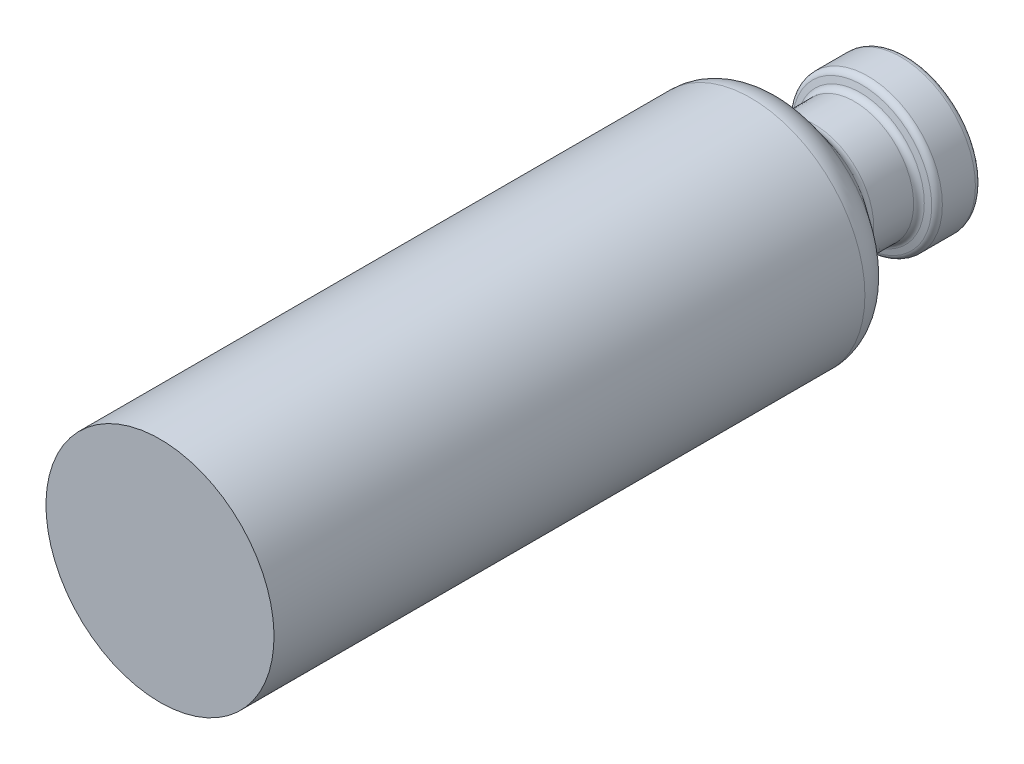
ISO-10303-21;
HEADER;
FILE_DESCRIPTION(('STEP AP214'),'2;1');
FILE_NAME('part.step','',(''),(''),'','','');
FILE_SCHEMA(('AUTOMOTIVE_DESIGN { 1 0 10303 214 1 1 1 1 }'));
ENDSEC;
DATA;
#1=APPLICATION_CONTEXT('core data for automotive mechanical design processes');
#2=APPLICATION_PROTOCOL_DEFINITION('international standard','automotive_design',2000,#1);
#3=PRODUCT_CONTEXT('',#1,'mechanical');
#4=PRODUCT('Part','Part','',(#3));
#5=PRODUCT_RELATED_PRODUCT_CATEGORY('part','',(#4));
#6=PRODUCT_DEFINITION_FORMATION('','',#4);
#7=PRODUCT_DEFINITION_CONTEXT('part definition',#1,'design');
#8=PRODUCT_DEFINITION('design','',#6,#7);
#9=PRODUCT_DEFINITION_SHAPE('','',#8);
#10=(LENGTH_UNIT() NAMED_UNIT(*) SI_UNIT(.MILLI.,.METRE.));
#11=(NAMED_UNIT(*) PLANE_ANGLE_UNIT() SI_UNIT($,.RADIAN.));
#12=(NAMED_UNIT(*) SI_UNIT($,.STERADIAN.) SOLID_ANGLE_UNIT());
#13=UNCERTAINTY_MEASURE_WITH_UNIT(LENGTH_MEASURE(1.E-05),#10,'distance_accuracy_value','');
#14=(GEOMETRIC_REPRESENTATION_CONTEXT(3) GLOBAL_UNCERTAINTY_ASSIGNED_CONTEXT((#13)) GLOBAL_UNIT_ASSIGNED_CONTEXT((#10,
#11,#12)) REPRESENTATION_CONTEXT('',''));
#15=CARTESIAN_POINT('',(0.,0.,0.));
#16=DIRECTION('',(0.,0.,1.));
#17=DIRECTION('',(1.,0.,0.));
#18=AXIS2_PLACEMENT_3D('',#15,#16,#17);
#19=CARTESIAN_POINT('',(0.,0.,36.1766330125474));
#20=DIRECTION('',(0.,0.,-1.));
#21=DIRECTION('',(0.,1.,0.));
#22=AXIS2_PLACEMENT_3D('',#19,#20,#21);
#23=CYLINDRICAL_SURFACE('',#22,5.475);
#24=DIRECTION('',(0.,0.,1.));
#25=VECTOR('',#24,1.);
#26=CARTESIAN_POINT('',(0.,-5.475,36.1766330125474));
#27=LINE('',#26,#25);
#28=CARTESIAN_POINT('',(0.,-5.475,7.80326602509486));
#29=VERTEX_POINT('',#28);
#30=CARTESIAN_POINT('',(0.,-5.475,36.175));
#31=VERTEX_POINT('',#30);
#32=EDGE_CURVE('E168',#29,#31,#27,.T.);
#33=ORIENTED_EDGE('',*,*,#32,.T.);
#34=CARTESIAN_POINT('',(0.,0.,36.175));
#35=DIRECTION('',(0.,0.,1.));
#36=DIRECTION('',(1.,0.,0.));
#37=AXIS2_PLACEMENT_3D('',#34,#35,#36);
#38=CIRCLE('',#37,5.475);
#39=EDGE_CURVE('E58',#31,#31,#38,.T.);
#40=ORIENTED_EDGE('',*,*,#39,.F.);
#41=ORIENTED_EDGE('',*,*,#32,.F.);
#42=CARTESIAN_POINT('',(0.,0.,7.80326602509486));
#43=DIRECTION('',(0.,0.,-1.));
#44=DIRECTION('',(1.,0.,0.));
#45=AXIS2_PLACEMENT_3D('',#42,#43,#44);
#46=CIRCLE('',#45,5.475);
#47=CARTESIAN_POINT('',(5.475,0.,7.80326602509486));
#48=VERTEX_POINT('',#47);
#49=EDGE_CURVE('E157',#48,#29,#46,.T.);
#50=ORIENTED_EDGE('',*,*,#49,.F.);
#51=CARTESIAN_POINT('',(0.,0.,7.80326602509486));
#52=DIRECTION('',(0.,0.,-1.));
#53=DIRECTION('',(1.,0.,0.));
#54=AXIS2_PLACEMENT_3D('',#51,#52,#53);
#55=CIRCLE('',#54,5.475);
#56=EDGE_CURVE('E167',#29,#48,#55,.T.);
#57=ORIENTED_EDGE('',*,*,#56,.F.);
#58=EDGE_LOOP('',(#33,#40,#41,#50,#57));
#59=FACE_BOUND('',#58,.T.);
#60=ADVANCED_FACE('F43',(#59),#23,.T.);
#61=CARTESIAN_POINT('',(0.,0.,0.492619400818587));
#62=DIRECTION('',(0.,0.,-1.));
#63=DIRECTION('',(0.,1.,0.));
#64=AXIS2_PLACEMENT_3D('',#61,#62,#63);
#65=CYLINDRICAL_SURFACE('',#64,1.775);
#66=CARTESIAN_POINT('',(0.,0.,0.485238801637173));
#67=DIRECTION('',(0.,0.,-1.));
#68=DIRECTION('',(1.,0.,0.));
#69=AXIS2_PLACEMENT_3D('',#66,#67,#68);
#70=CIRCLE('',#69,1.775);
#71=CARTESIAN_POINT('',(0.,-1.775,0.485238801637173));
#72=VERTEX_POINT('',#71);
#73=CARTESIAN_POINT('',(1.775,0.,0.485238801637173));
#74=VERTEX_POINT('',#73);
#75=EDGE_CURVE('E47',#72,#74,#70,.T.);
#76=ORIENTED_EDGE('',*,*,#75,.T.);
#77=CARTESIAN_POINT('',(0.,0.,0.485238801637173));
#78=DIRECTION('',(0.,0.,-1.));
#79=DIRECTION('',(1.,0.,0.));
#80=AXIS2_PLACEMENT_3D('',#77,#78,#79);
#81=CIRCLE('',#80,1.775);
#82=EDGE_CURVE('E223',#74,#72,#81,.T.);
#83=ORIENTED_EDGE('',*,*,#82,.T.);
#84=DIRECTION('',(0.,0.,1.));
#85=VECTOR('',#84,1.);
#86=CARTESIAN_POINT('',(0.,-1.775,0.492619400818587));
#87=LINE('',#86,#85);
#88=CARTESIAN_POINT('',(0.,-1.775,0.5));
#89=VERTEX_POINT('',#88);
#90=EDGE_CURVE('E11',#72,#89,#87,.T.);
#91=ORIENTED_EDGE('',*,*,#90,.T.);
#92=CARTESIAN_POINT('',(0.,0.,0.5));
#93=DIRECTION('',(0.,0.,-1.));
#94=DIRECTION('',(1.,0.,0.));
#95=AXIS2_PLACEMENT_3D('',#92,#93,#94);
#96=CIRCLE('',#95,1.775);
#97=EDGE_CURVE('E253',#89,#89,#96,.T.);
#98=ORIENTED_EDGE('',*,*,#97,.F.);
#99=ORIENTED_EDGE('',*,*,#90,.F.);
#100=EDGE_LOOP('',(#76,#83,#91,#98,#99));
#101=FACE_BOUND('',#100,.T.);
#102=ADVANCED_FACE('F277',(#101),#65,.F.);
#103=CARTESIAN_POINT('',(0.,0.,0.485238801637173));
#104=DIRECTION('',(0.,0.,-1.));
#105=DIRECTION('',(-1.,0.,0.));
#106=AXIS2_PLACEMENT_3D('',#103,#104,#105);
#107=TOROIDAL_SURFACE('',#106,2.175,0.4);
#108=ORIENTED_EDGE('',*,*,#75,.F.);
#109=ORIENTED_EDGE('',*,*,#82,.F.);
#110=CARTESIAN_POINT('',(2.175,0.,0.485238801637173));
#111=DIRECTION('',(0.,-1.,0.));
#112=DIRECTION('',(1.,0.,0.));
#113=AXIS2_PLACEMENT_3D('',#110,#111,#112);
#114=CIRCLE('',#113,0.4);
#115=CARTESIAN_POINT('',(2.25132359815062,0.,0.0925879282581075));
#116=VERTEX_POINT('',#115);
#117=EDGE_CURVE('E52',#74,#116,#114,.T.);
#118=ORIENTED_EDGE('',*,*,#117,.T.);
#119=CARTESIAN_POINT('',(0.,0.,0.0925879282581075));
#120=DIRECTION('',(0.,0.,-1.));
#121=DIRECTION('',(1.,0.,0.));
#122=AXIS2_PLACEMENT_3D('',#119,#120,#121);
#123=CIRCLE('',#122,2.25132359815062);
#124=CARTESIAN_POINT('',(0.,-2.25132359815062,0.0925879282581076));
#125=VERTEX_POINT('',#124);
#126=EDGE_CURVE('E190',#116,#125,#123,.T.);
#127=ORIENTED_EDGE('',*,*,#126,.T.);
#128=CARTESIAN_POINT('',(0.,0.,0.0925879282581075));
#129=DIRECTION('',(0.,0.,-1.));
#130=DIRECTION('',(1.,0.,0.));
#131=AXIS2_PLACEMENT_3D('',#128,#129,#130);
#132=CIRCLE('',#131,2.25132359815062);
#133=EDGE_CURVE('E191',#125,#116,#132,.T.);
#134=ORIENTED_EDGE('',*,*,#133,.T.);
#135=ORIENTED_EDGE('',*,*,#117,.F.);
#136=EDGE_LOOP('',(#108,#109,#118,#127,#134,#135));
#137=FACE_BOUND('',#136,.T.);
#138=ADVANCED_FACE('F257',(#137),#107,.T.);
#139=CARTESIAN_POINT('',(0.,0.,0.197642622708475));
#140=DIRECTION('',(0.,0.,1.));
#141=DIRECTION('',(0.,1.,0.));
#142=AXIS2_PLACEMENT_3D('',#139,#140,#141);
#143=CONICAL_SURFACE('',#142,2.79178314838179,1.37881010907552);
#144=ORIENTED_EDGE('',*,*,#133,.F.);
#145=DIRECTION('',(0.,-0.981627183447664,0.190808995376545));
#146=VECTOR('',#145,1.);
#147=CARTESIAN_POINT('',(0.,-2.79178314838179,0.197642622708475));
#148=LINE('',#147,#146);
#149=CARTESIAN_POINT('',(0.,-3.33224269861296,0.302697317158843));
#150=VERTEX_POINT('',#149);
#151=EDGE_CURVE('E188',#125,#150,#148,.T.);
#152=ORIENTED_EDGE('',*,*,#151,.T.);
#153=CARTESIAN_POINT('',(0.,0.,0.302697317158843));
#154=DIRECTION('',(0.,0.,-1.));
#155=DIRECTION('',(1.,0.,0.));
#156=AXIS2_PLACEMENT_3D('',#153,#154,#155);
#157=CIRCLE('',#156,3.33224269861296);
#158=CARTESIAN_POINT('',(3.33224269861296,0.,0.302697317158843));
#159=VERTEX_POINT('',#158);
#160=EDGE_CURVE('E186',#150,#159,#157,.T.);
#161=ORIENTED_EDGE('',*,*,#160,.T.);
#162=CARTESIAN_POINT('',(0.,0.,0.302697317158843));
#163=DIRECTION('',(0.,0.,-1.));
#164=DIRECTION('',(1.,0.,0.));
#165=AXIS2_PLACEMENT_3D('',#162,#163,#164);
#166=CIRCLE('',#165,3.33224269861296);
#167=EDGE_CURVE('E215',#159,#150,#166,.T.);
#168=ORIENTED_EDGE('',*,*,#167,.T.);
#169=ORIENTED_EDGE('',*,*,#151,.F.);
#170=ORIENTED_EDGE('',*,*,#126,.F.);
#171=EDGE_LOOP('',(#144,#152,#161,#168,#169,#170));
#172=FACE_BOUND('',#171,.T.);
#173=ADVANCED_FACE('F261',(#172),#143,.T.);
#174=CARTESIAN_POINT('',(0.,0.,0.597185472193142));
#175=DIRECTION('',(0.,0.,-1.));
#176=DIRECTION('',(-1.,0.,0.));
#177=AXIS2_PLACEMENT_3D('',#174,#175,#176);
#178=TOROIDAL_SURFACE('',#177,3.275,0.3);
#179=ORIENTED_EDGE('',*,*,#160,.F.);
#180=ORIENTED_EDGE('',*,*,#167,.F.);
#181=CARTESIAN_POINT('',(3.275,0.,0.597185472193142));
#182=DIRECTION('',(0.,-1.,0.));
#183=DIRECTION('',(1.,0.,0.));
#184=AXIS2_PLACEMENT_3D('',#181,#182,#183);
#185=CIRCLE('',#184,0.3);
#186=CARTESIAN_POINT('',(3.575,0.,0.597185472193142));
#187=VERTEX_POINT('',#186);
#188=EDGE_CURVE('E152',#159,#187,#185,.T.);
#189=ORIENTED_EDGE('',*,*,#188,.T.);
#190=CARTESIAN_POINT('',(0.,0.,0.597185472193142));
#191=DIRECTION('',(0.,0.,-1.));
#192=DIRECTION('',(1.,0.,0.));
#193=AXIS2_PLACEMENT_3D('',#190,#191,#192);
#194=CIRCLE('',#193,3.575);
#195=CARTESIAN_POINT('',(0.,-3.575,0.597185472193142));
#196=VERTEX_POINT('',#195);
#197=EDGE_CURVE('E148',#187,#196,#194,.T.);
#198=ORIENTED_EDGE('',*,*,#197,.T.);
#199=CARTESIAN_POINT('',(0.,0.,0.597185472193142));
#200=DIRECTION('',(0.,0.,-1.));
#201=DIRECTION('',(1.,0.,0.));
#202=AXIS2_PLACEMENT_3D('',#199,#200,#201);
#203=CIRCLE('',#202,3.575);
#204=EDGE_CURVE('E202',#196,#187,#203,.T.);
#205=ORIENTED_EDGE('',*,*,#204,.T.);
#206=ORIENTED_EDGE('',*,*,#188,.F.);
#207=EDGE_LOOP('',(#179,#180,#189,#198,#205,#206));
#208=FACE_BOUND('',#207,.T.);
#209=ADVANCED_FACE('F263',(#208),#178,.T.);
#210=CARTESIAN_POINT('',(0.,0.,1.39043596612367));
#211=DIRECTION('',(0.,0.,-1.));
#212=DIRECTION('',(0.,1.,0.));
#213=AXIS2_PLACEMENT_3D('',#210,#211,#212);
#214=CYLINDRICAL_SURFACE('',#213,3.575);
#215=ORIENTED_EDGE('',*,*,#204,.F.);
#216=DIRECTION('',(0.,0.,1.));
#217=VECTOR('',#216,1.);
#218=CARTESIAN_POINT('',(0.,-3.575,1.39043596612367));
#219=LINE('',#218,#217);
#220=CARTESIAN_POINT('',(0.,-3.575,2.18368646005421));
#221=VERTEX_POINT('',#220);
#222=EDGE_CURVE('E187',#196,#221,#219,.T.);
#223=ORIENTED_EDGE('',*,*,#222,.T.);
#224=CARTESIAN_POINT('',(0.,0.,2.18368646005421));
#225=DIRECTION('',(0.,0.,-1.));
#226=DIRECTION('',(1.,0.,0.));
#227=AXIS2_PLACEMENT_3D('',#224,#225,#226);
#228=CIRCLE('',#227,3.575);
#229=CARTESIAN_POINT('',(3.575,0.,2.18368646005421));
#230=VERTEX_POINT('',#229);
#231=EDGE_CURVE('E199',#221,#230,#228,.T.);
#232=ORIENTED_EDGE('',*,*,#231,.T.);
#233=CARTESIAN_POINT('',(0.,0.,2.18368646005421));
#234=DIRECTION('',(0.,0.,-1.));
#235=DIRECTION('',(1.,0.,0.));
#236=AXIS2_PLACEMENT_3D('',#233,#234,#235);
#237=CIRCLE('',#236,3.575);
#238=EDGE_CURVE('E196',#230,#221,#237,.T.);
#239=ORIENTED_EDGE('',*,*,#238,.T.);
#240=ORIENTED_EDGE('',*,*,#222,.F.);
#241=ORIENTED_EDGE('',*,*,#197,.F.);
#242=EDGE_LOOP('',(#215,#223,#232,#239,#240,#241));
#243=FACE_BOUND('',#242,.T.);
#244=ADVANCED_FACE('F265',(#243),#214,.T.);
#245=CARTESIAN_POINT('',(0.,0.,2.18368646005421));
#246=DIRECTION('',(0.,0.,-1.));
#247=DIRECTION('',(-1.,0.,0.));
#248=AXIS2_PLACEMENT_3D('',#245,#246,#247);
#249=TOROIDAL_SURFACE('',#248,3.275,0.3);
#250=ORIENTED_EDGE('',*,*,#231,.F.);
#251=ORIENTED_EDGE('',*,*,#238,.F.);
#252=CARTESIAN_POINT('',(3.275,0.,2.18368646005421));
#253=DIRECTION('',(0.,-1.,0.));
#254=DIRECTION('',(1.,0.,0.));
#255=AXIS2_PLACEMENT_3D('',#252,#253,#254);
#256=CIRCLE('',#255,0.3);
#257=CARTESIAN_POINT('',(3.35264571353076,0.,2.47346420794093));
#258=VERTEX_POINT('',#257);
#259=EDGE_CURVE('E198',#230,#258,#256,.T.);
#260=ORIENTED_EDGE('',*,*,#259,.T.);
#261=CARTESIAN_POINT('',(0.,0.,2.47346420794093));
#262=DIRECTION('',(0.,0.,-1.));
#263=DIRECTION('',(1.,0.,0.));
#264=AXIS2_PLACEMENT_3D('',#261,#262,#263);
#265=CIRCLE('',#264,3.35264571353076);
#266=CARTESIAN_POINT('',(0.,-3.35264571353076,2.47346420794093));
#267=VERTEX_POINT('',#266);
#268=EDGE_CURVE('E194',#258,#267,#265,.T.);
#269=ORIENTED_EDGE('',*,*,#268,.T.);
#270=CARTESIAN_POINT('',(0.,0.,2.47346420794093));
#271=DIRECTION('',(0.,0.,-1.));
#272=DIRECTION('',(1.,0.,0.));
#273=AXIS2_PLACEMENT_3D('',#270,#271,#272);
#274=CIRCLE('',#273,3.35264571353076);
#275=EDGE_CURVE('E195',#267,#258,#274,.T.);
#276=ORIENTED_EDGE('',*,*,#275,.T.);
#277=ORIENTED_EDGE('',*,*,#259,.F.);
#278=EDGE_LOOP('',(#250,#251,#260,#269,#276,#277));
#279=FACE_BOUND('',#278,.T.);
#280=ADVANCED_FACE('F271',(#279),#249,.T.);
#281=CARTESIAN_POINT('',(0.,0.,2.51106581691542));
#282=DIRECTION('',(0.,0.,-1.));
#283=DIRECTION('',(0.,1.,0.));
#284=AXIS2_PLACEMENT_3D('',#281,#282,#283);
#285=CONICAL_SURFACE('',#284,3.21231459839161,1.30899693899575);
#286=ORIENTED_EDGE('',*,*,#275,.F.);
#287=DIRECTION('',(0.,0.965925826289069,0.258819045102519));
#288=VECTOR('',#287,1.);
#289=CARTESIAN_POINT('',(0.,-3.21231459839161,2.51106581691542));
#290=LINE('',#289,#288);
#291=CARTESIAN_POINT('',(0.,-3.07198348325247,2.54866742588991));
#292=VERTEX_POINT('',#291);
#293=EDGE_CURVE('E192',#267,#292,#290,.T.);
#294=ORIENTED_EDGE('',*,*,#293,.T.);
#295=CARTESIAN_POINT('',(0.,0.,2.54866742588991));
#296=DIRECTION('',(0.,0.,-1.));
#297=DIRECTION('',(1.,0.,0.));
#298=AXIS2_PLACEMENT_3D('',#295,#296,#297);
#299=CIRCLE('',#298,3.07198348325247);
#300=CARTESIAN_POINT('',(3.07198348325247,0.,2.54866742588991));
#301=VERTEX_POINT('',#300);
#302=EDGE_CURVE('E231',#292,#301,#299,.T.);
#303=ORIENTED_EDGE('',*,*,#302,.T.);
#304=CARTESIAN_POINT('',(0.,0.,2.54866742588991));
#305=DIRECTION('',(0.,0.,-1.));
#306=DIRECTION('',(1.,0.,0.));
#307=AXIS2_PLACEMENT_3D('',#304,#305,#306);
#308=CIRCLE('',#307,3.07198348325247);
#309=EDGE_CURVE('E233',#301,#292,#308,.T.);
#310=ORIENTED_EDGE('',*,*,#309,.T.);
#311=ORIENTED_EDGE('',*,*,#293,.F.);
#312=ORIENTED_EDGE('',*,*,#268,.F.);
#313=EDGE_LOOP('',(#286,#294,#303,#310,#311,#312));
#314=FACE_BOUND('',#313,.T.);
#315=ADVANCED_FACE('F304',(#314),#285,.T.);
#316=CARTESIAN_POINT('',(0.,0.,2.83844517377663));
#317=DIRECTION('',(0.,0.,-1.));
#318=DIRECTION('',(-1.,0.,0.));
#319=AXIS2_PLACEMENT_3D('',#316,#317,#318);
#320=TOROIDAL_SURFACE('',#319,3.14962919678323,0.3);
#321=CARTESIAN_POINT('',(0.,0.,2.83849663779055));
#322=DIRECTION('',(0.,0.,-1.));
#323=DIRECTION('',(1.,0.,0.));
#324=AXIS2_PLACEMENT_3D('',#321,#322,#323);
#325=CIRCLE('',#324,2.84962920119747);
#326=CARTESIAN_POINT('',(0.,-2.84962920119747,2.83849663779055));
#327=VERTEX_POINT('',#326);
#328=CARTESIAN_POINT('',(2.84962920119747,0.,2.83849663779055));
#329=VERTEX_POINT('',#328);
#330=EDGE_CURVE('E230',#327,#329,#325,.T.);
#331=ORIENTED_EDGE('',*,*,#330,.T.);
#332=CARTESIAN_POINT('',(3.14962919678323,0.,2.83844517377663));
#333=DIRECTION('',(0.,-1.,0.));
#334=DIRECTION('',(1.,0.,0.));
#335=AXIS2_PLACEMENT_3D('',#332,#333,#334);
#336=CIRCLE('',#335,0.3);
#337=EDGE_CURVE('E218',#329,#301,#336,.T.);
#338=ORIENTED_EDGE('',*,*,#337,.T.);
#339=ORIENTED_EDGE('',*,*,#302,.F.);
#340=ORIENTED_EDGE('',*,*,#309,.F.);
#341=ORIENTED_EDGE('',*,*,#337,.F.);
#342=CARTESIAN_POINT('',(0.,0.,2.83849663779055));
#343=DIRECTION('',(0.,0.,-1.));
#344=DIRECTION('',(1.,0.,0.));
#345=AXIS2_PLACEMENT_3D('',#342,#343,#344);
#346=CIRCLE('',#345,2.84962920119747);
#347=EDGE_CURVE('E216',#329,#327,#346,.T.);
#348=ORIENTED_EDGE('',*,*,#347,.T.);
#349=EDGE_LOOP('',(#331,#338,#339,#340,#341,#348));
#350=FACE_BOUND('',#349,.T.);
#351=ADVANCED_FACE('F286',(#350),#320,.F.);
#352=CARTESIAN_POINT('',(0.,0.,3.79598862127023));
#353=DIRECTION('',(0.,0.,1.));
#354=DIRECTION('',(0.,1.,0.));
#355=AXIS2_PLACEMENT_3D('',#352,#353,#354);
#356=CONICAL_SURFACE('',#355,2.84979345580244,0.00017154671375515);
#357=ORIENTED_EDGE('',*,*,#330,.F.);
#358=DIRECTION('',(0.,-0.000171546713069514,0.999999985285863));
#359=VECTOR('',#358,1.);
#360=CARTESIAN_POINT('',(0.,-2.84979345580244,3.79598862127023));
#361=LINE('',#360,#359);
#362=CARTESIAN_POINT('',(0.,-2.84995771040741,4.7534806047499));
#363=VERTEX_POINT('',#362);
#364=EDGE_CURVE('E219',#327,#363,#361,.T.);
#365=ORIENTED_EDGE('',*,*,#364,.T.);
#366=CARTESIAN_POINT('',(0.,0.,4.7534806047499));
#367=DIRECTION('',(0.,0.,-1.));
#368=DIRECTION('',(1.,0.,0.));
#369=AXIS2_PLACEMENT_3D('',#366,#367,#368);
#370=CIRCLE('',#369,2.84995771040741);
#371=CARTESIAN_POINT('',(2.84995771040741,0.,4.7534806047499));
#372=VERTEX_POINT('',#371);
#373=EDGE_CURVE('E180',#363,#372,#370,.T.);
#374=ORIENTED_EDGE('',*,*,#373,.T.);
#375=CARTESIAN_POINT('',(0.,0.,4.7534806047499));
#376=DIRECTION('',(0.,0.,-1.));
#377=DIRECTION('',(1.,0.,0.));
#378=AXIS2_PLACEMENT_3D('',#375,#376,#377);
#379=CIRCLE('',#378,2.84995771040741);
#380=EDGE_CURVE('E183',#372,#363,#379,.T.);
#381=ORIENTED_EDGE('',*,*,#380,.T.);
#382=ORIENTED_EDGE('',*,*,#364,.F.);
#383=ORIENTED_EDGE('',*,*,#347,.F.);
#384=EDGE_LOOP('',(#357,#365,#374,#381,#382,#383));
#385=FACE_BOUND('',#384,.T.);
#386=ADVANCED_FACE('F287',(#385),#356,.T.);
#387=CARTESIAN_POINT('',(0.,0.,4.75339483139337));
#388=DIRECTION('',(0.,0.,-1.));
#389=DIRECTION('',(-1.,0.,0.));
#390=AXIS2_PLACEMENT_3D('',#387,#388,#389);
#391=TOROIDAL_SURFACE('',#390,3.34995770305035,0.5);
#392=CARTESIAN_POINT('',(0.,0.,5.15007150153899));
#393=DIRECTION('',(0.,0.,-1.));
#394=DIRECTION('',(1.,0.,0.));
#395=AXIS2_PLACEMENT_3D('',#392,#393,#394);
#396=CIRCLE('',#395,3.04557698854599);
#397=CARTESIAN_POINT('',(0.,-3.04557698854599,5.15007150153899));
#398=VERTEX_POINT('',#397);
#399=CARTESIAN_POINT('',(3.04557698854599,0.,5.15007150153899));
#400=VERTEX_POINT('',#399);
#401=EDGE_CURVE('E162',#398,#400,#396,.T.);
#402=ORIENTED_EDGE('',*,*,#401,.T.);
#403=CARTESIAN_POINT('',(3.34995770305035,0.,4.75339483139337));
#404=DIRECTION('',(0.,-1.,0.));
#405=DIRECTION('',(1.,0.,0.));
#406=AXIS2_PLACEMENT_3D('',#403,#404,#405);
#407=CIRCLE('',#406,0.5);
#408=EDGE_CURVE('E184',#400,#372,#407,.T.);
#409=ORIENTED_EDGE('',*,*,#408,.T.);
#410=ORIENTED_EDGE('',*,*,#373,.F.);
#411=ORIENTED_EDGE('',*,*,#380,.F.);
#412=ORIENTED_EDGE('',*,*,#408,.F.);
#413=CARTESIAN_POINT('',(0.,0.,5.15007150153899));
#414=DIRECTION('',(0.,0.,-1.));
#415=DIRECTION('',(1.,0.,0.));
#416=AXIS2_PLACEMENT_3D('',#413,#414,#415);
#417=CIRCLE('',#416,3.04557698854599);
#418=EDGE_CURVE('E108',#400,#398,#417,.T.);
#419=ORIENTED_EDGE('',*,*,#418,.T.);
#420=EDGE_LOOP('',(#402,#409,#410,#411,#412,#419));
#421=FACE_BOUND('',#420,.T.);
#422=ADVANCED_FACE('F290',(#421),#391,.F.);
#423=CARTESIAN_POINT('',(0.,0.,5.84198609108393));
#424=DIRECTION('',(0.,0.,1.));
#425=DIRECTION('',(0.,1.,0.));
#426=AXIS2_PLACEMENT_3D('',#423,#424,#425);
#427=CONICAL_SURFACE('',#426,3.94729763747997,0.916297857297023);
#428=ORIENTED_EDGE('',*,*,#401,.F.);
#429=DIRECTION('',(0.,-0.793353340291235,0.608761429008721));
#430=VECTOR('',#429,1.);
#431=CARTESIAN_POINT('',(0.,-3.94729763747997,5.84198609108393));
#432=LINE('',#431,#430);
#433=CARTESIAN_POINT('',(0.,-4.84901828641395,6.53390068062888));
#434=VERTEX_POINT('',#433);
#435=EDGE_CURVE('E178',#398,#434,#432,.T.);
#436=ORIENTED_EDGE('',*,*,#435,.T.);
#437=CARTESIAN_POINT('',(0.,0.,6.53390068062888));
#438=DIRECTION('',(0.,0.,-1.));
#439=DIRECTION('',(1.,0.,0.));
#440=AXIS2_PLACEMENT_3D('',#437,#438,#439);
#441=CIRCLE('',#440,4.84901828641395);
#442=CARTESIAN_POINT('',(4.84901828641395,0.,6.53390068062888));
#443=VERTEX_POINT('',#442);
#444=EDGE_CURVE('E169',#434,#443,#441,.T.);
#445=ORIENTED_EDGE('',*,*,#444,.T.);
#446=CARTESIAN_POINT('',(0.,0.,6.53390068062888));
#447=DIRECTION('',(0.,0.,-1.));
#448=DIRECTION('',(1.,0.,0.));
#449=AXIS2_PLACEMENT_3D('',#446,#447,#448);
#450=CIRCLE('',#449,4.84901828641395);
#451=EDGE_CURVE('E160',#443,#434,#450,.T.);
#452=ORIENTED_EDGE('',*,*,#451,.T.);
#453=ORIENTED_EDGE('',*,*,#435,.F.);
#454=ORIENTED_EDGE('',*,*,#418,.F.);
#455=EDGE_LOOP('',(#428,#436,#445,#452,#453,#454));
#456=FACE_BOUND('',#455,.T.);
#457=ADVANCED_FACE('F292',(#456),#427,.T.);
#458=CARTESIAN_POINT('',(0.,0.,7.80326602509486));
#459=DIRECTION('',(0.,0.,-1.));
#460=DIRECTION('',(-1.,0.,0.));
#461=AXIS2_PLACEMENT_3D('',#458,#459,#460);
#462=TOROIDAL_SURFACE('',#461,3.875,1.6);
#463=ORIENTED_EDGE('',*,*,#444,.F.);
#464=ORIENTED_EDGE('',*,*,#451,.F.);
#465=CARTESIAN_POINT('',(3.875,0.,7.80326602509486));
#466=DIRECTION('',(0.,-1.,0.));
#467=DIRECTION('',(1.,0.,0.));
#468=AXIS2_PLACEMENT_3D('',#465,#466,#467);
#469=CIRCLE('',#468,1.6);
#470=EDGE_CURVE('E119',#443,#48,#469,.T.);
#471=ORIENTED_EDGE('',*,*,#470,.T.);
#472=ORIENTED_EDGE('',*,*,#49,.T.);
#473=ORIENTED_EDGE('',*,*,#56,.T.);
#474=ORIENTED_EDGE('',*,*,#470,.F.);
#475=EDGE_LOOP('',(#463,#464,#471,#472,#473,#474));
#476=FACE_BOUND('',#475,.T.);
#477=ADVANCED_FACE('F45',(#476),#462,.T.);
#478=CARTESIAN_POINT('',(0.,0.,0.));
#479=DIRECTION('',(0.,0.,-1.));
#480=DIRECTION('',(0.,-1.,0.));
#481=AXIS2_PLACEMENT_3D('',#478,#479,#480);
#482=PLANE('',#481);
#483=CARTESIAN_POINT('',(0.,0.,0.));
#484=DIRECTION('',(0.,0.,-1.));
#485=DIRECTION('',(1.,0.,0.));
#486=AXIS2_PLACEMENT_3D('',#483,#484,#485);
#487=CIRCLE('',#486,0.775);
#488=CARTESIAN_POINT('',(0.,-0.775,0.));
#489=VERTEX_POINT('',#488);
#490=EDGE_CURVE('E174',#489,#489,#487,.T.);
#491=ORIENTED_EDGE('',*,*,#490,.T.);
#492=EDGE_LOOP('',(#491));
#493=FACE_BOUND('',#492,.T.);
#494=ADVANCED_FACE('F306',(#493),#482,.T.);
#495=CARTESIAN_POINT('',(0.,0.,0.25));
#496=DIRECTION('',(0.,0.,-1.));
#497=DIRECTION('',(0.,1.,0.));
#498=AXIS2_PLACEMENT_3D('',#495,#496,#497);
#499=CYLINDRICAL_SURFACE('',#498,0.775);
#500=ORIENTED_EDGE('',*,*,#490,.F.);
#501=DIRECTION('',(0.,0.,1.));
#502=VECTOR('',#501,1.);
#503=CARTESIAN_POINT('',(0.,-0.775,0.25));
#504=LINE('',#503,#502);
#505=CARTESIAN_POINT('',(0.,-0.775,0.5));
#506=VERTEX_POINT('',#505);
#507=EDGE_CURVE('E171',#489,#506,#504,.T.);
#508=ORIENTED_EDGE('',*,*,#507,.T.);
#509=CARTESIAN_POINT('',(0.,0.,0.5));
#510=DIRECTION('',(0.,0.,-1.));
#511=DIRECTION('',(1.,0.,0.));
#512=AXIS2_PLACEMENT_3D('',#509,#510,#511);
#513=CIRCLE('',#512,0.775);
#514=EDGE_CURVE('E211',#506,#506,#513,.T.);
#515=ORIENTED_EDGE('',*,*,#514,.T.);
#516=ORIENTED_EDGE('',*,*,#507,.F.);
#517=EDGE_LOOP('',(#500,#508,#515,#516));
#518=FACE_BOUND('',#517,.T.);
#519=ADVANCED_FACE('F300',(#518),#499,.T.);
#520=CARTESIAN_POINT('',(0.,0.775,0.5));
#521=DIRECTION('',(0.,0.,-1.));
#522=DIRECTION('',(0.,-1.,0.));
#523=AXIS2_PLACEMENT_3D('',#520,#521,#522);
#524=PLANE('',#523);
#525=ORIENTED_EDGE('',*,*,#514,.F.);
#526=EDGE_LOOP('',(#525));
#527=FACE_BOUND('',#526,.T.);
#528=ORIENTED_EDGE('',*,*,#97,.T.);
#529=EDGE_LOOP('',(#528));
#530=FACE_BOUND('',#529,.T.);
#531=ADVANCED_FACE('F296',(#527,#530),#524,.T.);
#532=CARTESIAN_POINT('',(0.,0.,36.175));
#533=DIRECTION('',(0.,0.,1.));
#534=DIRECTION('',(1.,0.,0.));
#535=AXIS2_PLACEMENT_3D('',#532,#533,#534);
#536=PLANE('',#535);
#537=ORIENTED_EDGE('',*,*,#39,.T.);
#538=EDGE_LOOP('',(#537));
#539=FACE_BOUND('',#538,.T.);
#540=ADVANCED_FACE('F299',(#539),#536,.T.);
#541=CLOSED_SHELL('',(#60,#102,#138,#173,#209,#244,#280,#315,#351,#386,#422,#457,#477,#494,#519,
#531,#540));
#542=MANIFOLD_SOLID_BREP('B2',#541);
#543=ADVANCED_BREP_SHAPE_REPRESENTATION('',(#18,#542),#14);
#544=SHAPE_DEFINITION_REPRESENTATION(#9,#543);
ENDSEC;
END-ISO-10303-21;
